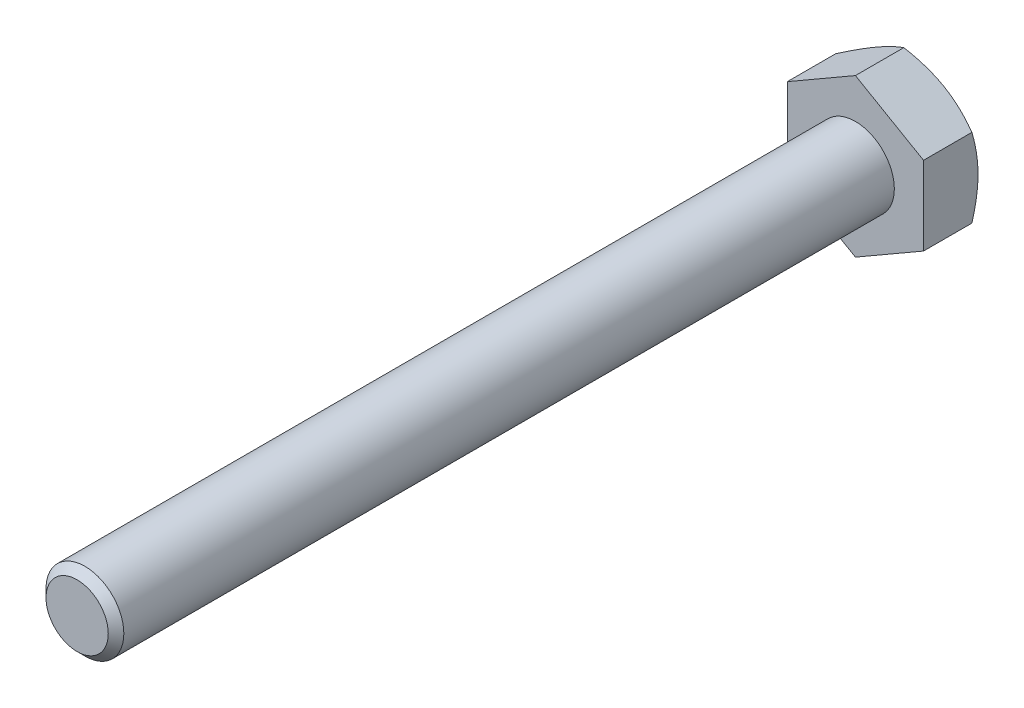
ISO-10303-21;
HEADER;
FILE_DESCRIPTION(('STEP AP214'),'2;1');
FILE_NAME('part.step','',(''),(''),'','','');
FILE_SCHEMA(('AUTOMOTIVE_DESIGN { 1 0 10303 214 1 1 1 1 }'));
ENDSEC;
DATA;
#1=APPLICATION_CONTEXT('core data for automotive mechanical design processes');
#2=APPLICATION_PROTOCOL_DEFINITION('international standard','automotive_design',2000,#1);
#3=PRODUCT_CONTEXT('',#1,'mechanical');
#4=PRODUCT('Part','Part','',(#3));
#5=PRODUCT_RELATED_PRODUCT_CATEGORY('part','',(#4));
#6=PRODUCT_DEFINITION_FORMATION('','',#4);
#7=PRODUCT_DEFINITION_CONTEXT('part definition',#1,'design');
#8=PRODUCT_DEFINITION('design','',#6,#7);
#9=PRODUCT_DEFINITION_SHAPE('','',#8);
#10=(LENGTH_UNIT() NAMED_UNIT(*) SI_UNIT(.MILLI.,.METRE.));
#11=(NAMED_UNIT(*) PLANE_ANGLE_UNIT() SI_UNIT($,.RADIAN.));
#12=(NAMED_UNIT(*) SI_UNIT($,.STERADIAN.) SOLID_ANGLE_UNIT());
#13=UNCERTAINTY_MEASURE_WITH_UNIT(LENGTH_MEASURE(1.E-05),#10,'distance_accuracy_value','');
#14=(GEOMETRIC_REPRESENTATION_CONTEXT(3) GLOBAL_UNCERTAINTY_ASSIGNED_CONTEXT((#13)) GLOBAL_UNIT_ASSIGNED_CONTEXT((#10,
#11,#12)) REPRESENTATION_CONTEXT('',''));
#15=CARTESIAN_POINT('',(0.,0.,0.));
#16=DIRECTION('',(0.,0.,1.));
#17=DIRECTION('',(1.,0.,0.));
#18=AXIS2_PLACEMENT_3D('',#15,#16,#17);
#19=CARTESIAN_POINT('',(0.,0.,40.));
#20=DIRECTION('',(0.,0.,1.));
#21=DIRECTION('',(1.,0.,0.));
#22=AXIS2_PLACEMENT_3D('',#19,#20,#21);
#23=PLANE('',#22);
#24=CARTESIAN_POINT('',(0.,0.,40.));
#25=DIRECTION('',(0.,0.,1.));
#26=DIRECTION('',(1.,0.,0.));
#27=AXIS2_PLACEMENT_3D('',#24,#25,#26);
#28=CIRCLE('',#27,1.6);
#29=CARTESIAN_POINT('',(1.60000000000001,0.,40.));
#30=VERTEX_POINT('',#29);
#31=EDGE_CURVE('E269',#30,#30,#28,.T.);
#32=ORIENTED_EDGE('',*,*,#31,.T.);
#33=EDGE_LOOP('',(#32));
#34=FACE_BOUND('',#33,.T.);
#35=ADVANCED_FACE('F32',(#34),#23,.T.);
#36=CARTESIAN_POINT('',(0.,0.,0.));
#37=DIRECTION('',(0.,0.,1.));
#38=DIRECTION('',(1.,0.,0.));
#39=AXIS2_PLACEMENT_3D('',#36,#37,#38);
#40=CYLINDRICAL_SURFACE('',#39,2.);
#41=CARTESIAN_POINT('',(0.,0.,39.6));
#42=DIRECTION('',(0.,0.,1.));
#43=DIRECTION('',(1.,0.,0.));
#44=AXIS2_PLACEMENT_3D('',#41,#42,#43);
#45=CIRCLE('',#44,2.);
#46=CARTESIAN_POINT('',(2.,0.,39.6));
#47=VERTEX_POINT('',#46);
#48=EDGE_CURVE('E240',#47,#47,#45,.F.);
#49=ORIENTED_EDGE('',*,*,#48,.T.);
#50=EDGE_LOOP('',(#49));
#51=FACE_BOUND('',#50,.T.);
#52=CARTESIAN_POINT('',(0.,0.,0.));
#53=DIRECTION('',(0.,0.,1.));
#54=DIRECTION('',(1.,0.,0.));
#55=AXIS2_PLACEMENT_3D('',#52,#53,#54);
#56=CIRCLE('',#55,2.);
#57=CARTESIAN_POINT('',(2.,0.,0.));
#58=VERTEX_POINT('',#57);
#59=EDGE_CURVE('E266',#58,#58,#56,.F.);
#60=ORIENTED_EDGE('',*,*,#59,.F.);
#61=EDGE_LOOP('',(#60));
#62=FACE_BOUND('',#61,.T.);
#63=ADVANCED_FACE('F204',(#51,#62),#40,.T.);
#64=CARTESIAN_POINT('',(0.,0.,40.));
#65=DIRECTION('',(0.,0.,-1.));
#66=DIRECTION('',(-1.,0.,0.));
#67=AXIS2_PLACEMENT_3D('',#64,#65,#66);
#68=CONICAL_SURFACE('',#67,1.6,0.785398163397445);
#69=ORIENTED_EDGE('',*,*,#48,.F.);
#70=EDGE_LOOP('',(#69));
#71=FACE_BOUND('',#70,.T.);
#72=ORIENTED_EDGE('',*,*,#31,.F.);
#73=EDGE_LOOP('',(#72));
#74=FACE_BOUND('',#73,.T.);
#75=ADVANCED_FACE('F34',(#71,#74),#68,.T.);
#76=CARTESIAN_POINT('',(0.,4.04145188432739,-2.8));
#77=DIRECTION('',(0.499999999999998,0.86602540378444,0.));
#78=DIRECTION('',(-0.86602540378444,0.499999999999998,0.));
#79=AXIS2_PLACEMENT_3D('',#76,#77,#78);
#80=PLANE('',#79);
#81=CARTESIAN_POINT('',(-0.000200000000018282,4.04156735438123,-2.48732593930663));
#82=CARTESIAN_POINT('',(0.153607178452432,3.95276673849841,-2.53861421101001));
#83=CARTESIAN_POINT('',(0.308742010834407,3.86319960126199,-2.5852590461838));
#84=CARTESIAN_POINT('',(0.621698006576765,3.68251437287563,-2.66667812446665));
#85=CARTESIAN_POINT('',(0.779524730787481,3.59139307116726,-2.70142356441544));
#86=CARTESIAN_POINT('',(1.09322221038011,3.41027974688035,-2.75550997281716));
#87=CARTESIAN_POINT('',(1.24904469916068,3.32031559103709,-2.77521091373962));
#88=CARTESIAN_POINT('',(1.56142288720536,3.13996396008053,-2.79872986726275));
#89=CARTESIAN_POINT('',(1.71797745103422,3.04957714051107,-2.80256735545444));
#90=CARTESIAN_POINT('',(2.01050921992098,2.88068384499778,-2.79458469812302));
#91=CARTESIAN_POINT('',(2.1465302124579,2.80215208834115,-2.78472456593039));
#92=CARTESIAN_POINT('',(2.41768602028899,2.64560020969754,-2.7534735331006));
#93=CARTESIAN_POINT('',(2.55281989768468,2.56758062920651,-2.7320719567142));
#94=CARTESIAN_POINT('',(2.82453479240518,2.41070596159679,-2.67856959211942));
#95=CARTESIAN_POINT('',(2.96108141927833,2.33187072981464,-2.64624200555491));
#96=CARTESIAN_POINT('',(3.2321380929445,2.17537608630784,-2.57287106619201));
#97=CARTESIAN_POINT('',(3.36665161246854,2.09771466960099,-2.53184495343013));
#98=CARTESIAN_POINT('',(3.5002,2.02061047210986,-2.48732593930663));
#99=B_SPLINE_CURVE_WITH_KNOTS('',3,(#81,#82,#83,#84,#85,#86,#87,#88,#89,#90,#91,#92,#93,#94,#95,
#96,#97,#98),.UNSPECIFIED.,.F.,.F.,(4,2,2,2,2,2,2,2,4),(0.,0.554793832886255,1.11092123814984,
1.65328467083219,2.19498204478404,2.66665130850861,3.13875761298269,3.62133612600511,
4.10296698719189),.UNSPECIFIED.);
#100=CARTESIAN_POINT('',(0.,4.04145188432739,-2.48739260883035));
#101=VERTEX_POINT('',#100);
#102=CARTESIAN_POINT('',(1.74999999999999,3.03108891324554,-2.8));
#103=VERTEX_POINT('',#102);
#104=EDGE_CURVE('E228',#101,#103,#99,.T.);
#105=ORIENTED_EDGE('',*,*,#104,.F.);
#106=DIRECTION('',(0.,0.,1.));
#107=VECTOR('',#106,1.);
#108=CARTESIAN_POINT('',(0.,4.04145188432739,-2.8));
#109=LINE('',#108,#107);
#110=CARTESIAN_POINT('',(0.,4.04145188432739,0.));
#111=VERTEX_POINT('',#110);
#112=EDGE_CURVE('E225',#101,#111,#109,.T.);
#113=ORIENTED_EDGE('',*,*,#112,.T.);
#114=DIRECTION('',(-0.86602540378444,0.499999999999998,0.));
#115=VECTOR('',#114,1.);
#116=CARTESIAN_POINT('',(0.,4.04145188432739,0.));
#117=LINE('',#116,#115);
#118=CARTESIAN_POINT('',(3.5,2.0207259421637,0.));
#119=VERTEX_POINT('',#118);
#120=EDGE_CURVE('E233',#119,#111,#117,.T.);
#121=ORIENTED_EDGE('',*,*,#120,.F.);
#122=DIRECTION('',(0.,0.,1.));
#123=VECTOR('',#122,1.);
#124=CARTESIAN_POINT('',(3.5,2.0207259421637,-2.8));
#125=LINE('',#124,#123);
#126=CARTESIAN_POINT('',(3.5,2.0207259421637,-2.48739260883035));
#127=VERTEX_POINT('',#126);
#128=EDGE_CURVE('E258',#127,#119,#125,.T.);
#129=ORIENTED_EDGE('',*,*,#128,.F.);
#130=EDGE_CURVE('E177',#103,#127,#99,.T.);
#131=ORIENTED_EDGE('',*,*,#130,.F.);
#132=EDGE_LOOP('',(#105,#113,#121,#129,#131));
#133=FACE_BOUND('',#132,.T.);
#134=ADVANCED_FACE('F188',(#133),#80,.T.);
#135=CARTESIAN_POINT('',(3.5,-2.0207259421637,-2.8));
#136=DIRECTION('',(1.,0.,0.));
#137=DIRECTION('',(0.,0.,-1.));
#138=AXIS2_PLACEMENT_3D('',#135,#136,#137);
#139=PLANE('',#138);
#140=CARTESIAN_POINT('',(3.5,-5.5115599132137,-1.05123027842014));
#141=CARTESIAN_POINT('',(3.5,-5.35795146168121,-1.12607664094827));
#142=CARTESIAN_POINT('',(3.5,-5.20399921009229,-1.20022907517413));
#143=CARTESIAN_POINT('',(3.5,-4.89522454872942,-1.34675734914902));
#144=CARTESIAN_POINT('',(3.5,-4.74040201352888,-1.41913292430435));
#145=CARTESIAN_POINT('',(3.5,-4.42894615034129,-1.56206506717812));
#146=CARTESIAN_POINT('',(3.5,-4.27230759822603,-1.63261028917771));
#147=CARTESIAN_POINT('',(3.5,-3.95781335182267,-1.77092284895817));
#148=CARTESIAN_POINT('',(3.5,-3.79995771311103,-1.83869031269911));
#149=CARTESIAN_POINT('',(3.5,-3.47741113153966,-1.97295074269912));
#150=CARTESIAN_POINT('',(3.5,-3.31266966015408,-2.03932296039635));
#151=CARTESIAN_POINT('',(3.5,-2.98129055183975,-2.16724360933954));
#152=CARTESIAN_POINT('',(3.5,-2.81465270912935,-2.22879151125521));
#153=CARTESIAN_POINT('',(3.5,-2.47950135030689,-2.34550906477687));
#154=CARTESIAN_POINT('',(3.5,-2.31099212862996,-2.40069092778852));
#155=CARTESIAN_POINT('',(3.5,-1.9715578800388,-2.50296137699356));
#156=CARTESIAN_POINT('',(3.5,-1.80063360505408,-2.55005242468974));
#157=CARTESIAN_POINT('',(3.5,-1.45721769418154,-2.63368726814516));
#158=CARTESIAN_POINT('',(3.5,-1.284740691287,-2.67029006719255));
#159=CARTESIAN_POINT('',(3.5,-0.937557025087316,-2.73093355614778));
#160=CARTESIAN_POINT('',(3.5,-0.762850606367499,-2.75497561213941));
#161=CARTESIAN_POINT('',(3.5,-0.41439625684188,-2.78826920086828));
#162=CARTESIAN_POINT('',(3.5,-0.24066759256781,-2.79771739417793));
#163=CARTESIAN_POINT('',(3.5,0.106974360360036,-2.80154556659445));
#164=CARTESIAN_POINT('',(3.5,0.280887651698044,-2.7959253235422));
#165=CARTESIAN_POINT('',(3.5,0.57367772999446,-2.77418399451728));
#166=CARTESIAN_POINT('',(3.5,0.692856453275199,-2.76187051371579));
#167=CARTESIAN_POINT('',(3.5,0.930390570440087,-2.73088957270953));
#168=CARTESIAN_POINT('',(3.5,1.04874585973469,-2.71222131985519));
#169=CARTESIAN_POINT('',(3.5,1.40238821087656,-2.64766060469304));
#170=CARTESIAN_POINT('',(3.5,1.636135180366,-2.59322203585637));
#171=CARTESIAN_POINT('',(3.5,1.98584040729011,-2.49818174698124));
#172=CARTESIAN_POINT('',(3.5,2.10359260573205,-2.46379952268766));
#173=CARTESIAN_POINT('',(3.5,2.3379545290403,-2.39130577472369));
#174=CARTESIAN_POINT('',(3.5,2.45456424508592,-2.35319422228545));
#175=CARTESIAN_POINT('',(3.5,2.68667648503228,-2.27386649986118));
#176=CARTESIAN_POINT('',(3.5,2.80217931014601,-2.23265120318029));
#177=CARTESIAN_POINT('',(3.5,3.0322162217769,-2.14761668191578));
#178=CARTESIAN_POINT('',(3.5,3.14675033047978,-2.10379751715191));
#179=CARTESIAN_POINT('',(3.5,3.45518824474215,-1.98241358076653));
#180=CARTESIAN_POINT('',(3.5,3.64827858337665,-1.90278371704724));
#181=CARTESIAN_POINT('',(3.5,4.03246733734996,-1.738838783469));
#182=CARTESIAN_POINT('',(3.5,4.22356552793095,-1.6545231916082));
#183=CARTESIAN_POINT('',(3.5,4.60422080078615,-1.48231977624898));
#184=CARTESIAN_POINT('',(3.5,4.79377731975278,-1.3944307117281));
#185=CARTESIAN_POINT('',(3.5,5.17160542987793,-1.21592705795529));
#186=CARTESIAN_POINT('',(3.5,5.35987698121651,-1.12531238470558));
#187=CARTESIAN_POINT('',(3.5,5.73567568183911,-0.941812491523437));
#188=CARTESIAN_POINT('',(3.5,5.92320119040395,-0.848923918398865));
#189=CARTESIAN_POINT('',(3.5,6.29740401332882,-0.661451949679656));
#190=CARTESIAN_POINT('',(3.5,6.4840813186156,-0.566868536008528));
#191=CARTESIAN_POINT('',(3.5,7.04299370579127,-0.281137350976761));
#192=CARTESIAN_POINT('',(3.5,7.41419418594083,-0.0879667587069206));
#193=CARTESIAN_POINT('',(3.5,8.1154529737333,0.28131090771229));
#194=CARTESIAN_POINT('',(3.5,8.44570240603792,0.457056799003233));
#195=CARTESIAN_POINT('',(3.5,9.10509095269334,0.810667080198443));
#196=CARTESIAN_POINT('',(3.5,9.4342299968145,0.988531600993423));
#197=CARTESIAN_POINT('',(3.5,10.0905480448887,1.34522643131465));
#198=CARTESIAN_POINT('',(3.5,10.4177299168719,1.52405147197681));
#199=CARTESIAN_POINT('',(3.5,11.0714005801046,1.88290305302714));
#200=CARTESIAN_POINT('',(3.5,11.397889424295,2.06292949694077));
#201=CARTESIAN_POINT('',(3.5,11.7241348717818,2.24339321716844));
#202=B_SPLINE_CURVE_WITH_KNOTS('',3,(#140,#141,#142,#143,#144,#145,#146,#147,#148,#149,#150,
#151,#152,#153,#154,#155,#156,#157,#158,#159,#160,#161,#162,#163,#164,#165,#166,#167,#168,#169,
#170,#171,#172,#173,#174,#175,#176,#177,#178,#179,#180,#181,#182,#183,#184,#185,#186,#187,#188,
#189,#190,#191,#192,#193,#194,#195,#196,#197,#198,#199,#200,#201),.UNSPECIFIED.,.F.,.F.,(4,2,2,
2,2,2,2,2,2,2,2,2,2,2,2,2,2,2,2,2,2,2,2,2,2,2,2,2,2,2,4),(0.,0.512624455055139,1.02532478807014,
1.54067716579031,2.05600614845994,2.58877526662743,3.12160275933497,3.65339055670451,
4.18501627844404,4.71358974605645,5.24210571499797,5.76343550148058,6.28477297414903,
6.64403977227188,7.00335139923845,7.72232402023062,8.09029789782061,8.45827461416728,
8.82614817645966,9.19401329070559,9.82051720102626,10.4470910459092,11.0738843824793,
11.7006970553932,12.3284975462801,12.9563047370264,14.2116350789245,15.333929259245,
16.4562931392235,17.5748776783279,18.6933734490332),.UNSPECIFIED.);
#203=CARTESIAN_POINT('',(3.5,0.,-2.8));
#204=VERTEX_POINT('',#203);
#205=EDGE_CURVE('E175',#127,#204,#202,.F.);
#206=ORIENTED_EDGE('',*,*,#205,.F.);
#207=ORIENTED_EDGE('',*,*,#128,.T.);
#208=DIRECTION('',(0.,1.,0.));
#209=VECTOR('',#208,1.);
#210=CARTESIAN_POINT('',(3.5,-2.0207259421637,0.));
#211=LINE('',#210,#209);
#212=CARTESIAN_POINT('',(3.5,-2.0207259421637,0.));
#213=VERTEX_POINT('',#212);
#214=EDGE_CURVE('E265',#213,#119,#211,.T.);
#215=ORIENTED_EDGE('',*,*,#214,.F.);
#216=DIRECTION('',(0.,0.,1.));
#217=VECTOR('',#216,1.);
#218=CARTESIAN_POINT('',(3.5,-2.0207259421637,-2.8));
#219=LINE('',#218,#217);
#220=CARTESIAN_POINT('',(3.5,-2.0207259421637,-2.48739260883036));
#221=VERTEX_POINT('',#220);
#222=EDGE_CURVE('E243',#221,#213,#219,.T.);
#223=ORIENTED_EDGE('',*,*,#222,.F.);
#224=EDGE_CURVE('E169',#204,#221,#202,.F.);
#225=ORIENTED_EDGE('',*,*,#224,.F.);
#226=EDGE_LOOP('',(#206,#207,#215,#223,#225));
#227=FACE_BOUND('',#226,.T.);
#228=ADVANCED_FACE('F184',(#227),#139,.T.);
#229=CARTESIAN_POINT('',(0.,-4.04145188432739,-2.8));
#230=DIRECTION('',(0.499999999999998,-0.86602540378444,0.));
#231=DIRECTION('',(0.86602540378444,0.499999999999998,0.));
#232=AXIS2_PLACEMENT_3D('',#229,#230,#231);
#233=PLANE('',#232);
#234=CARTESIAN_POINT('',(3.5002,-2.02061047210986,-2.48732593930663));
#235=CARTESIAN_POINT('',(3.34639282154755,-2.10941108799268,-2.53861421101002));
#236=CARTESIAN_POINT('',(3.19125798916558,-2.1989782252291,-2.5852590461838));
#237=CARTESIAN_POINT('',(2.87830199342322,-2.37966345361546,-2.66667812446665));
#238=CARTESIAN_POINT('',(2.7204752692125,-2.47078475532383,-2.70142356441544));
#239=CARTESIAN_POINT('',(2.40677778961987,-2.65189807961074,-2.75550997281716));
#240=CARTESIAN_POINT('',(2.25095530083931,-2.741862235454,-2.77521091373962));
#241=CARTESIAN_POINT('',(1.93857711279462,-2.92221386641056,-2.79872986726275));
#242=CARTESIAN_POINT('',(1.78202254896577,-3.01260068598002,-2.80256735545444));
#243=CARTESIAN_POINT('',(1.48949078007901,-3.1814939814933,-2.79458469812302));
#244=CARTESIAN_POINT('',(1.35346978754209,-3.26002573814993,-2.78472456593039));
#245=CARTESIAN_POINT('',(1.082313979711,-3.41657761679354,-2.7534735331006));
#246=CARTESIAN_POINT('',(0.947180102315307,-3.49459719728458,-2.7320719567142));
#247=CARTESIAN_POINT('',(0.675465207594804,-3.65147186489429,-2.67856959211942));
#248=CARTESIAN_POINT('',(0.538918580721651,-3.73030709667644,-2.64624200555491));
#249=CARTESIAN_POINT('',(0.267861907055482,-3.88680174018325,-2.572871066192));
#250=CARTESIAN_POINT('',(0.133348387531446,-3.9644631568901,-2.53184495343013));
#251=CARTESIAN_POINT('',(-0.00020000000001818,-4.04156735438123,-2.48732593930663));
#252=B_SPLINE_CURVE_WITH_KNOTS('',3,(#234,#235,#236,#237,#238,#239,#240,#241,#242,#243,#244,
#245,#246,#247,#248,#249,#250,#251),.UNSPECIFIED.,.F.,.F.,(4,2,2,2,2,2,2,2,4),(0.,
0.554793832886255,1.11092123814984,1.65328467083219,2.19498204478404,2.66665130850861,
3.13875761298269,3.62133612600511,4.10296698719189),.UNSPECIFIED.);
#253=CARTESIAN_POINT('',(1.74999999999999,-3.03108891324554,-2.8));
#254=VERTEX_POINT('',#253);
#255=EDGE_CURVE('E176',#221,#254,#252,.T.);
#256=ORIENTED_EDGE('',*,*,#255,.F.);
#257=ORIENTED_EDGE('',*,*,#222,.T.);
#258=DIRECTION('',(0.86602540378444,0.499999999999998,0.));
#259=VECTOR('',#258,1.);
#260=CARTESIAN_POINT('',(0.,-4.04145188432739,0.));
#261=LINE('',#260,#259);
#262=CARTESIAN_POINT('',(0.,-4.04145188432739,0.));
#263=VERTEX_POINT('',#262);
#264=EDGE_CURVE('E254',#263,#213,#261,.T.);
#265=ORIENTED_EDGE('',*,*,#264,.F.);
#266=DIRECTION('',(0.,0.,1.));
#267=VECTOR('',#266,1.);
#268=CARTESIAN_POINT('',(0.,-4.04145188432739,-2.8));
#269=LINE('',#268,#267);
#270=CARTESIAN_POINT('',(0.,-4.04145188432739,-2.48739260883035));
#271=VERTEX_POINT('',#270);
#272=EDGE_CURVE('E253',#271,#263,#269,.T.);
#273=ORIENTED_EDGE('',*,*,#272,.F.);
#274=EDGE_CURVE('E162',#254,#271,#252,.T.);
#275=ORIENTED_EDGE('',*,*,#274,.F.);
#276=EDGE_LOOP('',(#256,#257,#265,#273,#275));
#277=FACE_BOUND('',#276,.T.);
#278=ADVANCED_FACE('F187',(#277),#233,.T.);
#279=CARTESIAN_POINT('',(0.,-4.04145188432739,-2.8));
#280=DIRECTION('',(-0.500000000000002,-0.866025403784438,0.));
#281=DIRECTION('',(0.866025403784438,-0.500000000000002,0.));
#282=AXIS2_PLACEMENT_3D('',#279,#280,#281);
#283=PLANE('',#282);
#284=CARTESIAN_POINT('',(0.000199999999981852,-4.04156735438123,-2.48732593930663));
#285=CARTESIAN_POINT('',(-0.153607178452468,-3.95276673849841,-2.53861421101001));
#286=CARTESIAN_POINT('',(-0.308742010834443,-3.86319960126199,-2.5852590461838));
#287=CARTESIAN_POINT('',(-0.621698006576801,-3.68251437287563,-2.66667812446665));
#288=CARTESIAN_POINT('',(-0.779524730787515,-3.59139307116725,-2.70142356441544));
#289=CARTESIAN_POINT('',(-1.09322221038015,-3.41027974688034,-2.75550997281716));
#290=CARTESIAN_POINT('',(-1.24904469916071,-3.32031559103708,-2.77521091373962));
#291=CARTESIAN_POINT('',(-1.56142288720539,-3.13996396008052,-2.79872986726274));
#292=CARTESIAN_POINT('',(-1.71797745103425,-3.04957714051106,-2.80256735545443));
#293=CARTESIAN_POINT('',(-2.01050921992101,-2.88068384499777,-2.79458469812302));
#294=CARTESIAN_POINT('',(-2.14653021245793,-2.80215208834115,-2.78472456593039));
#295=CARTESIAN_POINT('',(-2.41768602028901,-2.64560020969754,-2.75347353310059));
#296=CARTESIAN_POINT('',(-2.5528198976847,-2.5675806292065,-2.7320719567142));
#297=CARTESIAN_POINT('',(-2.8245347924052,-2.41070596159679,-2.67856959211942));
#298=CARTESIAN_POINT('',(-2.96108141927835,-2.33187072981464,-2.64624200555491));
#299=CARTESIAN_POINT('',(-3.23213809294451,-2.17537608630784,-2.572871066192));
#300=CARTESIAN_POINT('',(-3.36665161246854,-2.09771466960099,-2.53184495343013));
#301=CARTESIAN_POINT('',(-3.5002,-2.02061047210986,-2.48732593930663));
#302=B_SPLINE_CURVE_WITH_KNOTS('',3,(#284,#285,#286,#287,#288,#289,#290,#291,#292,#293,#294,
#295,#296,#297,#298,#299,#300,#301),.UNSPECIFIED.,.F.,.F.,(4,2,2,2,2,2,2,2,4),(0.,
0.554793832886255,1.11092123814984,1.65328467083219,2.19498204478404,2.6666513085086,
3.13875761298267,3.62133612600509,4.10296698719186),.UNSPECIFIED.);
#303=CARTESIAN_POINT('',(-1.75000000000001,-3.03108891324553,-2.8));
#304=VERTEX_POINT('',#303);
#305=EDGE_CURVE('E249',#271,#304,#302,.T.);
#306=ORIENTED_EDGE('',*,*,#305,.F.);
#307=ORIENTED_EDGE('',*,*,#272,.T.);
#308=DIRECTION('',(0.866025403784438,-0.500000000000002,0.));
#309=VECTOR('',#308,1.);
#310=CARTESIAN_POINT('',(0.,-4.04145188432739,0.));
#311=LINE('',#310,#309);
#312=CARTESIAN_POINT('',(-3.5,-2.0207259421637,0.));
#313=VERTEX_POINT('',#312);
#314=EDGE_CURVE('E387',#313,#263,#311,.T.);
#315=ORIENTED_EDGE('',*,*,#314,.F.);
#316=DIRECTION('',(0.,0.,1.));
#317=VECTOR('',#316,1.);
#318=CARTESIAN_POINT('',(-3.5,-2.0207259421637,-2.8));
#319=LINE('',#318,#317);
#320=CARTESIAN_POINT('',(-3.5,-2.02072594216386,-2.48739260883046));
#321=VERTEX_POINT('',#320);
#322=EDGE_CURVE('E256',#321,#313,#319,.T.);
#323=ORIENTED_EDGE('',*,*,#322,.F.);
#324=EDGE_CURVE('E109',#304,#321,#302,.T.);
#325=ORIENTED_EDGE('',*,*,#324,.F.);
#326=EDGE_LOOP('',(#306,#307,#315,#323,#325));
#327=FACE_BOUND('',#326,.T.);
#328=ADVANCED_FACE('F193',(#327),#283,.T.);
#329=CARTESIAN_POINT('',(-3.5,-2.0207259421637,-2.8));
#330=DIRECTION('',(-1.,0.,0.));
#331=DIRECTION('',(0.,0.,1.));
#332=AXIS2_PLACEMENT_3D('',#329,#330,#331);
#333=PLANE('',#332);
#334=CARTESIAN_POINT('',(-3.5,-5.5115599132137,-1.05123027842014));
#335=CARTESIAN_POINT('',(-3.5,-5.35795146168121,-1.12607664094827));
#336=CARTESIAN_POINT('',(-3.5,-5.20399921009229,-1.20022907517413));
#337=CARTESIAN_POINT('',(-3.5,-4.89522454872942,-1.34675734914902));
#338=CARTESIAN_POINT('',(-3.5,-4.74040201352888,-1.41913292430435));
#339=CARTESIAN_POINT('',(-3.5,-4.42894615034129,-1.56206506717813));
#340=CARTESIAN_POINT('',(-3.5,-4.27230759822603,-1.63261028917771));
#341=CARTESIAN_POINT('',(-3.5,-3.95781335182267,-1.77092284895817));
#342=CARTESIAN_POINT('',(-3.5,-3.79995771311103,-1.83869031269911));
#343=CARTESIAN_POINT('',(-3.5,-3.47741113153966,-1.97295074269912));
#344=CARTESIAN_POINT('',(-3.5,-3.31266966015408,-2.03932296039635));
#345=CARTESIAN_POINT('',(-3.5,-2.98129055183975,-2.16724360933954));
#346=CARTESIAN_POINT('',(-3.5,-2.81465270912935,-2.22879151125521));
#347=CARTESIAN_POINT('',(-3.5,-2.47950135030689,-2.34550906477687));
#348=CARTESIAN_POINT('',(-3.5,-2.31099212862996,-2.40069092778851));
#349=CARTESIAN_POINT('',(-3.5,-1.9715578800388,-2.50296137699356));
#350=CARTESIAN_POINT('',(-3.5,-1.80063360505408,-2.55005242468974));
#351=CARTESIAN_POINT('',(-3.5,-1.45721769418154,-2.63368726814516));
#352=CARTESIAN_POINT('',(-3.5,-1.284740691287,-2.67029006719254));
#353=CARTESIAN_POINT('',(-3.5,-0.937557025087316,-2.73093355614778));
#354=CARTESIAN_POINT('',(-3.5,-0.7628506063675,-2.75497561213941));
#355=CARTESIAN_POINT('',(-3.5,-0.41439625684188,-2.78826920086828));
#356=CARTESIAN_POINT('',(-3.5,-0.240667592567811,-2.79771739417793));
#357=CARTESIAN_POINT('',(-3.5,0.106974360360035,-2.80154556659445));
#358=CARTESIAN_POINT('',(-3.5,0.280887651698044,-2.7959253235422));
#359=CARTESIAN_POINT('',(-3.5,0.573677729994459,-2.77418399451728));
#360=CARTESIAN_POINT('',(-3.5,0.692856453275198,-2.76187051371579));
#361=CARTESIAN_POINT('',(-3.5,0.930390570440087,-2.73088957270953));
#362=CARTESIAN_POINT('',(-3.5,1.04874585973469,-2.71222131985519));
#363=CARTESIAN_POINT('',(-3.5,1.40238821087656,-2.64766060469304));
#364=CARTESIAN_POINT('',(-3.5,1.636135180366,-2.59322203585637));
#365=CARTESIAN_POINT('',(-3.5,1.98584040729011,-2.49818174698124));
#366=CARTESIAN_POINT('',(-3.5,2.10359260573205,-2.46379952268766));
#367=CARTESIAN_POINT('',(-3.5,2.3379545290403,-2.39130577472369));
#368=CARTESIAN_POINT('',(-3.5,2.45456424508592,-2.35319422228545));
#369=CARTESIAN_POINT('',(-3.5,2.68667648503228,-2.27386649986119));
#370=CARTESIAN_POINT('',(-3.5,2.80217931014601,-2.23265120318029));
#371=CARTESIAN_POINT('',(-3.5,3.0322162217769,-2.14761668191579));
#372=CARTESIAN_POINT('',(-3.5,3.14675033047978,-2.10379751715191));
#373=CARTESIAN_POINT('',(-3.5,3.45518824474215,-1.98241358076653));
#374=CARTESIAN_POINT('',(-3.5,3.64827858337665,-1.90278371704724));
#375=CARTESIAN_POINT('',(-3.5,4.03246733734996,-1.738838783469));
#376=CARTESIAN_POINT('',(-3.5,4.22356552793095,-1.6545231916082));
#377=CARTESIAN_POINT('',(-3.5,4.60422080078615,-1.48231977624898));
#378=CARTESIAN_POINT('',(-3.5,4.79377731975278,-1.3944307117281));
#379=CARTESIAN_POINT('',(-3.5,5.17160542987793,-1.21592705795529));
#380=CARTESIAN_POINT('',(-3.5,5.3598769812165,-1.12531238470558));
#381=CARTESIAN_POINT('',(-3.5,5.7356756818391,-0.941812491523439));
#382=CARTESIAN_POINT('',(-3.5,5.92320119040394,-0.848923918398866));
#383=CARTESIAN_POINT('',(-3.5,6.29740401332881,-0.661451949679658));
#384=CARTESIAN_POINT('',(-3.5,6.4840813186156,-0.566868536008529));
#385=CARTESIAN_POINT('',(-3.5,7.04299370579126,-0.281137350976762));
#386=CARTESIAN_POINT('',(-3.5,7.41419418594082,-0.0879667587069218));
#387=CARTESIAN_POINT('',(-3.5,8.1154529737333,0.281310907712289));
#388=CARTESIAN_POINT('',(-3.5,8.44570240603792,0.457056799003232));
#389=CARTESIAN_POINT('',(-3.5,9.10509095269334,0.810667080198443));
#390=CARTESIAN_POINT('',(-3.5,9.4342299968145,0.988531600993422));
#391=CARTESIAN_POINT('',(-3.5,10.0905480448887,1.34522643131465));
#392=CARTESIAN_POINT('',(-3.5,10.4177299168718,1.52405147197681));
#393=CARTESIAN_POINT('',(-3.5,11.0714005801046,1.88290305302714));
#394=CARTESIAN_POINT('',(-3.5,11.397889424295,2.06292949694077));
#395=CARTESIAN_POINT('',(-3.5,11.7241348717818,2.24339321716844));
#396=B_SPLINE_CURVE_WITH_KNOTS('',3,(#334,#335,#336,#337,#338,#339,#340,#341,#342,#343,#344,
#345,#346,#347,#348,#349,#350,#351,#352,#353,#354,#355,#356,#357,#358,#359,#360,#361,#362,#363,
#364,#365,#366,#367,#368,#369,#370,#371,#372,#373,#374,#375,#376,#377,#378,#379,#380,#381,#382,
#383,#384,#385,#386,#387,#388,#389,#390,#391,#392,#393,#394,#395),.UNSPECIFIED.,.F.,.F.,(4,2,2,
2,2,2,2,2,2,2,2,2,2,2,2,2,2,2,2,2,2,2,2,2,2,2,2,2,2,2,4),(0.,0.51262445505514,1.02532478807014,
1.54067716579031,2.05600614845994,2.58877526662743,3.12160275933497,3.65339055670451,
4.18501627844404,4.71358974605645,5.24210571499797,5.76343550148057,6.28477297414903,
6.64403977227187,7.00335139923845,7.72232402023061,8.0902978978206,8.45827461416728,
8.82614817645965,9.19401329070559,9.82051720102626,10.4470910459092,11.0738843824793,
11.7006970553932,12.3284975462801,12.9563047370264,14.2116350789245,15.333929259245,
16.4562931392235,17.5748776783279,18.6933734490332),.UNSPECIFIED.);
#397=CARTESIAN_POINT('',(-3.5,0.,-2.8));
#398=VERTEX_POINT('',#397);
#399=EDGE_CURVE('E104',#321,#398,#396,.T.);
#400=ORIENTED_EDGE('',*,*,#399,.F.);
#401=ORIENTED_EDGE('',*,*,#322,.T.);
#402=DIRECTION('',(0.,-1.,0.));
#403=VECTOR('',#402,1.);
#404=CARTESIAN_POINT('',(-3.5,-2.0207259421637,0.));
#405=LINE('',#404,#403);
#406=CARTESIAN_POINT('',(-3.5,2.0207259421637,0.));
#407=VERTEX_POINT('',#406);
#408=EDGE_CURVE('E389',#407,#313,#405,.T.);
#409=ORIENTED_EDGE('',*,*,#408,.F.);
#410=DIRECTION('',(0.,0.,1.));
#411=VECTOR('',#410,1.);
#412=CARTESIAN_POINT('',(-3.5,2.0207259421637,-2.8));
#413=LINE('',#412,#411);
#414=CARTESIAN_POINT('',(-3.5,2.0207259421637,-2.48739260883035));
#415=VERTEX_POINT('',#414);
#416=EDGE_CURVE('E130',#415,#407,#413,.T.);
#417=ORIENTED_EDGE('',*,*,#416,.F.);
#418=EDGE_CURVE('E113',#398,#415,#396,.T.);
#419=ORIENTED_EDGE('',*,*,#418,.F.);
#420=EDGE_LOOP('',(#400,#401,#409,#417,#419));
#421=FACE_BOUND('',#420,.T.);
#422=ADVANCED_FACE('F128',(#421),#333,.T.);
#423=CARTESIAN_POINT('',(-3.5,2.0207259421637,-2.8));
#424=DIRECTION('',(-0.500000000000002,0.866025403784438,0.));
#425=DIRECTION('',(-0.866025403784438,-0.500000000000002,0.));
#426=AXIS2_PLACEMENT_3D('',#423,#424,#425);
#427=PLANE('',#426);
#428=CARTESIAN_POINT('',(-3.5002,2.02061047210986,-2.48732593930663));
#429=CARTESIAN_POINT('',(-3.34639282154755,2.10941108799268,-2.53861421101001));
#430=CARTESIAN_POINT('',(-3.19125798916558,2.1989782252291,-2.5852590461838));
#431=CARTESIAN_POINT('',(-2.87830199342322,2.37966345361546,-2.66667812446665));
#432=CARTESIAN_POINT('',(-2.72047526921251,2.47078475532383,-2.70142356441544));
#433=CARTESIAN_POINT('',(-2.40677778961987,2.65189807961075,-2.75550997281716));
#434=CARTESIAN_POINT('',(-2.25095530083931,2.741862235454,-2.77521091373962));
#435=CARTESIAN_POINT('',(-1.93857711279463,2.92221386641057,-2.79872986726274));
#436=CARTESIAN_POINT('',(-1.78202254896577,3.01260068598002,-2.80256735545443));
#437=CARTESIAN_POINT('',(-1.48949078007901,3.18149398149331,-2.79458469812302));
#438=CARTESIAN_POINT('',(-1.3534697875421,3.26002573814994,-2.78472456593039));
#439=CARTESIAN_POINT('',(-1.08231397971101,3.41657761679355,-2.75347353310059));
#440=CARTESIAN_POINT('',(-0.947180102315325,3.49459719728459,-2.7320719567142));
#441=CARTESIAN_POINT('',(-0.675465207594827,3.6514718648943,-2.67856959211942));
#442=CARTESIAN_POINT('',(-0.538918580721677,3.73030709667645,-2.64624200555491));
#443=CARTESIAN_POINT('',(-0.267861907055514,3.88680174018325,-2.572871066192));
#444=CARTESIAN_POINT('',(-0.13334838753148,3.9644631568901,-2.53184495343013));
#445=CARTESIAN_POINT('',(0.000199999999981511,4.04156735438123,-2.48732593930663));
#446=B_SPLINE_CURVE_WITH_KNOTS('',3,(#428,#429,#430,#431,#432,#433,#434,#435,#436,#437,#438,
#439,#440,#441,#442,#443,#444,#445),.UNSPECIFIED.,.F.,.F.,(4,2,2,2,2,2,2,2,4),(0.,
0.554793832886256,1.11092123814984,1.65328467083219,2.19498204478403,2.6666513085086,
3.13875761298267,3.62133612600509,4.10296698719186),.UNSPECIFIED.);
#447=CARTESIAN_POINT('',(-1.75000000000001,3.03108891324554,-2.8));
#448=VERTEX_POINT('',#447);
#449=EDGE_CURVE('E119',#415,#448,#446,.T.);
#450=ORIENTED_EDGE('',*,*,#449,.F.);
#451=ORIENTED_EDGE('',*,*,#416,.T.);
#452=DIRECTION('',(-0.866025403784438,-0.500000000000002,0.));
#453=VECTOR('',#452,1.);
#454=CARTESIAN_POINT('',(-3.5,2.0207259421637,0.));
#455=LINE('',#454,#453);
#456=EDGE_CURVE('E235',#111,#407,#455,.T.);
#457=ORIENTED_EDGE('',*,*,#456,.F.);
#458=ORIENTED_EDGE('',*,*,#112,.F.);
#459=EDGE_CURVE('E121',#448,#101,#446,.T.);
#460=ORIENTED_EDGE('',*,*,#459,.F.);
#461=EDGE_LOOP('',(#450,#451,#457,#458,#460));
#462=FACE_BOUND('',#461,.T.);
#463=ADVANCED_FACE('F201',(#462),#427,.T.);
#464=CARTESIAN_POINT('',(3.5,2.0207259421637,0.));
#465=DIRECTION('',(0.,0.,1.));
#466=DIRECTION('',(1.,0.,0.));
#467=AXIS2_PLACEMENT_3D('',#464,#465,#466);
#468=PLANE('',#467);
#469=ORIENTED_EDGE('',*,*,#59,.T.);
#470=EDGE_LOOP('',(#469));
#471=FACE_BOUND('',#470,.T.);
#472=ORIENTED_EDGE('',*,*,#120,.T.);
#473=ORIENTED_EDGE('',*,*,#456,.T.);
#474=ORIENTED_EDGE('',*,*,#408,.T.);
#475=ORIENTED_EDGE('',*,*,#314,.T.);
#476=ORIENTED_EDGE('',*,*,#264,.T.);
#477=ORIENTED_EDGE('',*,*,#214,.T.);
#478=EDGE_LOOP('',(#472,#473,#474,#475,#476,#477));
#479=FACE_BOUND('',#478,.T.);
#480=ADVANCED_FACE('F190',(#471,#479),#468,.T.);
#481=CARTESIAN_POINT('',(0.,0.,0.));
#482=DIRECTION('',(0.,0.,1.));
#483=DIRECTION('',(1.,0.,0.));
#484=AXIS2_PLACEMENT_3D('',#481,#482,#483);
#485=CONICAL_SURFACE('',#484,8.34974226119285,1.0471975511966);
#486=ORIENTED_EDGE('',*,*,#130,.T.);
#487=ORIENTED_EDGE('',*,*,#205,.T.);
#488=CARTESIAN_POINT('',(0.,0.,-2.8));
#489=DIRECTION('',(0.,0.,1.));
#490=DIRECTION('',(1.,0.,0.));
#491=AXIS2_PLACEMENT_3D('',#488,#489,#490);
#492=CIRCLE('',#491,3.5);
#493=EDGE_CURVE('E36',#103,#204,#492,.F.);
#494=ORIENTED_EDGE('',*,*,#493,.F.);
#495=EDGE_LOOP('',(#486,#487,#494));
#496=FACE_BOUND('',#495,.T.);
#497=ADVANCED_FACE('F221',(#496),#485,.T.);
#498=ORIENTED_EDGE('',*,*,#104,.T.);
#499=EDGE_CURVE('E126',#448,#103,#492,.F.);
#500=ORIENTED_EDGE('',*,*,#499,.F.);
#501=ORIENTED_EDGE('',*,*,#459,.T.);
#502=EDGE_LOOP('',(#498,#500,#501));
#503=FACE_BOUND('',#502,.T.);
#504=ADVANCED_FACE('F154',(#503),#485,.T.);
#505=ORIENTED_EDGE('',*,*,#418,.T.);
#506=ORIENTED_EDGE('',*,*,#449,.T.);
#507=CARTESIAN_POINT('',(0.,0.,-2.8));
#508=DIRECTION('',(0.,0.,-1.));
#509=DIRECTION('',(-1.,0.,0.));
#510=AXIS2_PLACEMENT_3D('',#507,#508,#509);
#511=CIRCLE('',#510,3.5);
#512=EDGE_CURVE('E54',#398,#448,#511,.T.);
#513=ORIENTED_EDGE('',*,*,#512,.F.);
#514=EDGE_LOOP('',(#505,#506,#513));
#515=FACE_BOUND('',#514,.T.);
#516=ADVANCED_FACE('F117',(#515),#485,.T.);
#517=ORIENTED_EDGE('',*,*,#324,.T.);
#518=ORIENTED_EDGE('',*,*,#399,.T.);
#519=EDGE_CURVE('E106',#304,#398,#492,.F.);
#520=ORIENTED_EDGE('',*,*,#519,.F.);
#521=EDGE_LOOP('',(#517,#518,#520));
#522=FACE_BOUND('',#521,.T.);
#523=ADVANCED_FACE('F105',(#522),#485,.T.);
#524=ORIENTED_EDGE('',*,*,#274,.T.);
#525=ORIENTED_EDGE('',*,*,#305,.T.);
#526=EDGE_CURVE('E41',#254,#304,#492,.F.);
#527=ORIENTED_EDGE('',*,*,#526,.F.);
#528=EDGE_LOOP('',(#524,#525,#527));
#529=FACE_BOUND('',#528,.T.);
#530=ADVANCED_FACE('F251',(#529),#485,.T.);
#531=ORIENTED_EDGE('',*,*,#224,.T.);
#532=ORIENTED_EDGE('',*,*,#255,.T.);
#533=EDGE_CURVE('E11',#204,#254,#492,.F.);
#534=ORIENTED_EDGE('',*,*,#533,.F.);
#535=EDGE_LOOP('',(#531,#532,#534));
#536=FACE_BOUND('',#535,.T.);
#537=ADVANCED_FACE('F245',(#536),#485,.T.);
#538=CARTESIAN_POINT('',(3.5,2.0207259421637,-2.8));
#539=DIRECTION('',(0.,0.,1.));
#540=DIRECTION('',(1.,0.,0.));
#541=AXIS2_PLACEMENT_3D('',#538,#539,#540);
#542=PLANE('',#541);
#543=ORIENTED_EDGE('',*,*,#493,.T.);
#544=ORIENTED_EDGE('',*,*,#533,.T.);
#545=ORIENTED_EDGE('',*,*,#526,.T.);
#546=ORIENTED_EDGE('',*,*,#519,.T.);
#547=ORIENTED_EDGE('',*,*,#512,.T.);
#548=ORIENTED_EDGE('',*,*,#499,.T.);
#549=EDGE_LOOP('',(#543,#544,#545,#546,#547,#548));
#550=FACE_BOUND('',#549,.T.);
#551=ADVANCED_FACE('F124',(#550),#542,.F.);
#552=CLOSED_SHELL('',(#35,#63,#75,#134,#228,#278,#328,#422,#463,#480,#497,#504,#516,#523,#530,
#537,#551));
#553=MANIFOLD_SOLID_BREP('B2',#552);
#554=ADVANCED_BREP_SHAPE_REPRESENTATION('',(#18,#553),#14);
#555=SHAPE_DEFINITION_REPRESENTATION(#9,#554);
ENDSEC;
END-ISO-10303-21;
